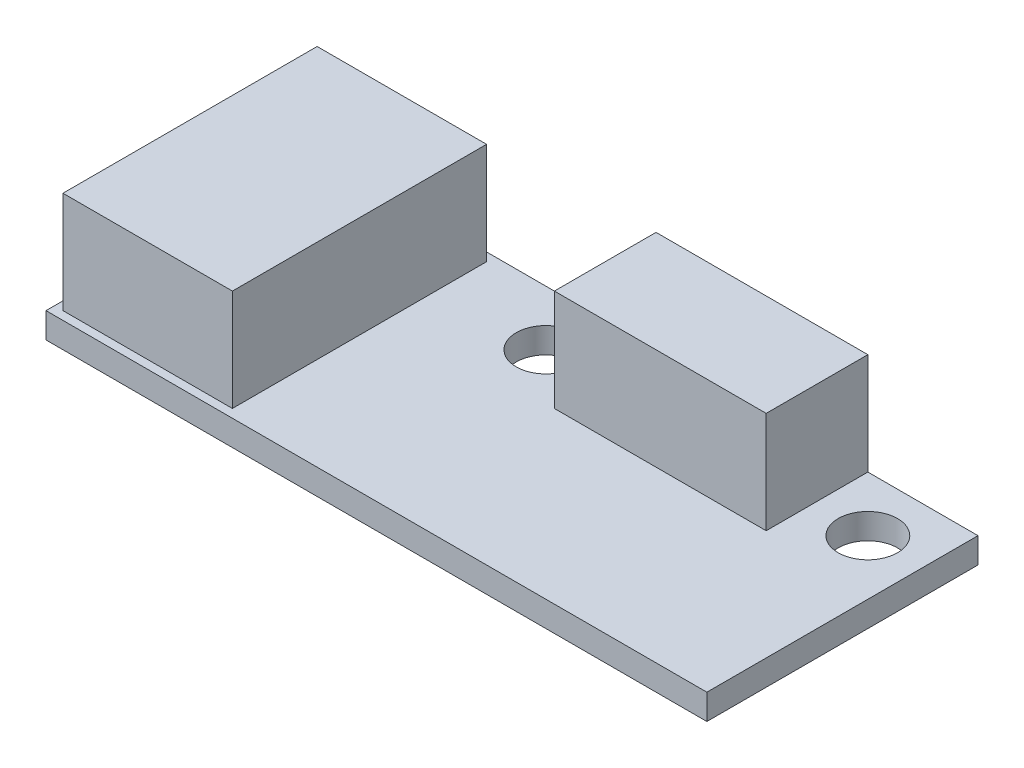
ISO-10303-21;
HEADER;
FILE_DESCRIPTION(('STEP AP214'),'2;1');
FILE_NAME('part.step','',(''),(''),'','','');
FILE_SCHEMA(('AUTOMOTIVE_DESIGN { 1 0 10303 214 1 1 1 1 }'));
ENDSEC;
DATA;
#1=APPLICATION_CONTEXT('core data for automotive mechanical design processes');
#2=APPLICATION_PROTOCOL_DEFINITION('international standard','automotive_design',2000,#1);
#3=PRODUCT_CONTEXT('',#1,'mechanical');
#4=PRODUCT('Part','Part','',(#3));
#5=PRODUCT_RELATED_PRODUCT_CATEGORY('part','',(#4));
#6=PRODUCT_DEFINITION_FORMATION('','',#4);
#7=PRODUCT_DEFINITION_CONTEXT('part definition',#1,'design');
#8=PRODUCT_DEFINITION('design','',#6,#7);
#9=PRODUCT_DEFINITION_SHAPE('','',#8);
#10=(LENGTH_UNIT() NAMED_UNIT(*) SI_UNIT(.MILLI.,.METRE.));
#11=(NAMED_UNIT(*) PLANE_ANGLE_UNIT() SI_UNIT($,.RADIAN.));
#12=(NAMED_UNIT(*) SI_UNIT($,.STERADIAN.) SOLID_ANGLE_UNIT());
#13=UNCERTAINTY_MEASURE_WITH_UNIT(LENGTH_MEASURE(1.E-05),#10,'distance_accuracy_value','');
#14=(GEOMETRIC_REPRESENTATION_CONTEXT(3) GLOBAL_UNCERTAINTY_ASSIGNED_CONTEXT((#13)) GLOBAL_UNIT_ASSIGNED_CONTEXT((#10,
#11,#12)) REPRESENTATION_CONTEXT('',''));
#15=CARTESIAN_POINT('',(0.,0.,0.));
#16=DIRECTION('',(0.,0.,1.));
#17=DIRECTION('',(1.,0.,0.));
#18=AXIS2_PLACEMENT_3D('',#15,#16,#17);
#19=CARTESIAN_POINT('',(0.,1.5,0.));
#20=DIRECTION('',(0.,-1.,0.));
#21=DIRECTION('',(0.,0.,-1.));
#22=AXIS2_PLACEMENT_3D('',#19,#20,#21);
#23=PLANE('',#22);
#24=DIRECTION('',(0.,0.,-1.));
#25=VECTOR('',#24,1.);
#26=CARTESIAN_POINT('',(13.,1.5,-8.));
#27=LINE('',#26,#25);
#28=CARTESIAN_POINT('',(13.,1.5,-2.));
#29=VERTEX_POINT('',#28);
#30=CARTESIAN_POINT('',(13.,1.5,-8.));
#31=VERTEX_POINT('',#30);
#32=EDGE_CURVE('E38',#29,#31,#27,.T.);
#33=ORIENTED_EDGE('',*,*,#32,.F.);
#34=DIRECTION('',(1.,0.,0.));
#35=VECTOR('',#34,1.);
#36=CARTESIAN_POINT('',(13.,1.5,-2.));
#37=LINE('',#36,#35);
#38=CARTESIAN_POINT('',(0.499999999999997,1.5,-2.));
#39=VERTEX_POINT('',#38);
#40=EDGE_CURVE('E158',#39,#29,#37,.T.);
#41=ORIENTED_EDGE('',*,*,#40,.F.);
#42=DIRECTION('',(0.,0.,1.));
#43=VECTOR('',#42,1.);
#44=CARTESIAN_POINT('',(0.499999999999997,1.5,-8.));
#45=LINE('',#44,#43);
#46=CARTESIAN_POINT('',(0.499999999999997,1.5,-8.));
#47=VERTEX_POINT('',#46);
#48=EDGE_CURVE('E149',#47,#39,#45,.T.);
#49=ORIENTED_EDGE('',*,*,#48,.F.);
#50=DIRECTION('',(-1.,0.,0.));
#51=VECTOR('',#50,1.);
#52=CARTESIAN_POINT('',(-19.5,1.5,-8.));
#53=LINE('',#52,#51);
#54=CARTESIAN_POINT('',(-19.5,1.5,-8.));
#55=VERTEX_POINT('',#54);
#56=EDGE_CURVE('E191',#47,#55,#53,.T.);
#57=ORIENTED_EDGE('',*,*,#56,.T.);
#58=DIRECTION('',(0.,0.,1.));
#59=VECTOR('',#58,1.);
#60=CARTESIAN_POINT('',(-19.5,1.5,8.));
#61=LINE('',#60,#59);
#62=CARTESIAN_POINT('',(-19.5,1.5,8.));
#63=VERTEX_POINT('',#62);
#64=EDGE_CURVE('E195',#55,#63,#61,.T.);
#65=ORIENTED_EDGE('',*,*,#64,.T.);
#66=DIRECTION('',(1.,0.,0.));
#67=VECTOR('',#66,1.);
#68=CARTESIAN_POINT('',(-19.5,1.5,8.));
#69=LINE('',#68,#67);
#70=CARTESIAN_POINT('',(19.5,1.5,8.));
#71=VERTEX_POINT('',#70);
#72=EDGE_CURVE('E211',#63,#71,#69,.T.);
#73=ORIENTED_EDGE('',*,*,#72,.T.);
#74=DIRECTION('',(0.,0.,-1.));
#75=VECTOR('',#74,1.);
#76=CARTESIAN_POINT('',(19.5,1.5,8.));
#77=LINE('',#76,#75);
#78=CARTESIAN_POINT('',(19.5,1.5,-8.));
#79=VERTEX_POINT('',#78);
#80=EDGE_CURVE('E188',#71,#79,#77,.T.);
#81=ORIENTED_EDGE('',*,*,#80,.T.);
#82=EDGE_CURVE('E201',#79,#31,#53,.T.);
#83=ORIENTED_EDGE('',*,*,#82,.T.);
#84=EDGE_LOOP('',(#33,#41,#49,#57,#65,#73,#81,#83));
#85=FACE_BOUND('',#84,.T.);
#86=CARTESIAN_POINT('',(-2.75,1.5,-4.75));
#87=DIRECTION('',(0.,1.,0.));
#88=DIRECTION('',(0.,0.,1.));
#89=AXIS2_PLACEMENT_3D('',#86,#87,#88);
#90=CIRCLE('',#89,1.75);
#91=CARTESIAN_POINT('',(-2.75,1.5,-3.));
#92=VERTEX_POINT('',#91);
#93=EDGE_CURVE('E178',#92,#92,#90,.T.);
#94=ORIENTED_EDGE('',*,*,#93,.F.);
#95=EDGE_LOOP('',(#94));
#96=FACE_BOUND('',#95,.T.);
#97=CARTESIAN_POINT('',(16.25,1.5,-4.75));
#98=DIRECTION('',(0.,1.,0.));
#99=DIRECTION('',(0.,0.,1.));
#100=AXIS2_PLACEMENT_3D('',#97,#98,#99);
#101=CIRCLE('',#100,1.75);
#102=CARTESIAN_POINT('',(16.25,1.5,-3.));
#103=VERTEX_POINT('',#102);
#104=EDGE_CURVE('E177',#103,#103,#101,.T.);
#105=ORIENTED_EDGE('',*,*,#104,.F.);
#106=EDGE_LOOP('',(#105));
#107=FACE_BOUND('',#106,.T.);
#108=DIRECTION('',(-1.,0.,0.));
#109=VECTOR('',#108,1.);
#110=CARTESIAN_POINT('',(-9.00000000000001,1.5,-7.5));
#111=LINE('',#110,#109);
#112=CARTESIAN_POINT('',(-9.00000000000001,1.5,-7.5));
#113=VERTEX_POINT('',#112);
#114=CARTESIAN_POINT('',(-19.,1.5,-7.5));
#115=VERTEX_POINT('',#114);
#116=EDGE_CURVE('E146',#113,#115,#111,.T.);
#117=ORIENTED_EDGE('',*,*,#116,.F.);
#118=DIRECTION('',(0.,0.,-1.));
#119=VECTOR('',#118,1.);
#120=CARTESIAN_POINT('',(-9.00000000000001,1.5,-7.5));
#121=LINE('',#120,#119);
#122=CARTESIAN_POINT('',(-9.00000000000001,1.5,7.5));
#123=VERTEX_POINT('',#122);
#124=EDGE_CURVE('E143',#123,#113,#121,.T.);
#125=ORIENTED_EDGE('',*,*,#124,.F.);
#126=DIRECTION('',(1.,0.,0.));
#127=VECTOR('',#126,1.);
#128=CARTESIAN_POINT('',(-19.,1.5,7.5));
#129=LINE('',#128,#127);
#130=CARTESIAN_POINT('',(-19.,1.5,7.5));
#131=VERTEX_POINT('',#130);
#132=EDGE_CURVE('E57',#131,#123,#129,.T.);
#133=ORIENTED_EDGE('',*,*,#132,.F.);
#134=DIRECTION('',(0.,0.,1.));
#135=VECTOR('',#134,1.);
#136=CARTESIAN_POINT('',(-19.,1.5,-7.5));
#137=LINE('',#136,#135);
#138=EDGE_CURVE('E52',#115,#131,#137,.T.);
#139=ORIENTED_EDGE('',*,*,#138,.F.);
#140=EDGE_LOOP('',(#117,#125,#133,#139));
#141=FACE_BOUND('',#140,.T.);
#142=ADVANCED_FACE('F34',(#85,#96,#107,#141),#23,.F.);
#143=CARTESIAN_POINT('',(19.5,1.5,8.));
#144=DIRECTION('',(-1.,0.,0.));
#145=DIRECTION('',(0.,0.,1.));
#146=AXIS2_PLACEMENT_3D('',#143,#144,#145);
#147=PLANE('',#146);
#148=DIRECTION('',(0.,0.,-1.));
#149=VECTOR('',#148,1.);
#150=CARTESIAN_POINT('',(19.5,0.,8.));
#151=LINE('',#150,#149);
#152=CARTESIAN_POINT('',(19.5,0.,8.));
#153=VERTEX_POINT('',#152);
#154=CARTESIAN_POINT('',(19.5,0.,-8.));
#155=VERTEX_POINT('',#154);
#156=EDGE_CURVE('E185',#153,#155,#151,.T.);
#157=ORIENTED_EDGE('',*,*,#156,.T.);
#158=DIRECTION('',(0.,-1.,0.));
#159=VECTOR('',#158,1.);
#160=CARTESIAN_POINT('',(19.5,1.5,-8.));
#161=LINE('',#160,#159);
#162=EDGE_CURVE('E11',#79,#155,#161,.T.);
#163=ORIENTED_EDGE('',*,*,#162,.F.);
#164=ORIENTED_EDGE('',*,*,#80,.F.);
#165=DIRECTION('',(0.,-1.,0.));
#166=VECTOR('',#165,1.);
#167=CARTESIAN_POINT('',(19.5,1.5,8.));
#168=LINE('',#167,#166);
#169=EDGE_CURVE('E208',#71,#153,#168,.T.);
#170=ORIENTED_EDGE('',*,*,#169,.T.);
#171=EDGE_LOOP('',(#157,#163,#164,#170));
#172=FACE_BOUND('',#171,.T.);
#173=ADVANCED_FACE('F36',(#172),#147,.F.);
#174=CARTESIAN_POINT('',(-19.5,1.5,-8.));
#175=DIRECTION('',(0.,0.,1.));
#176=DIRECTION('',(1.,0.,0.));
#177=AXIS2_PLACEMENT_3D('',#174,#175,#176);
#178=PLANE('',#177);
#179=DIRECTION('',(-1.,0.,0.));
#180=VECTOR('',#179,1.);
#181=CARTESIAN_POINT('',(-19.5,0.,-8.));
#182=LINE('',#181,#180);
#183=CARTESIAN_POINT('',(-19.5,0.,-8.));
#184=VERTEX_POINT('',#183);
#185=EDGE_CURVE('E215',#155,#184,#182,.T.);
#186=ORIENTED_EDGE('',*,*,#185,.T.);
#187=DIRECTION('',(0.,-1.,0.));
#188=VECTOR('',#187,1.);
#189=CARTESIAN_POINT('',(-19.5,1.5,-8.));
#190=LINE('',#189,#188);
#191=EDGE_CURVE('E44',#55,#184,#190,.T.);
#192=ORIENTED_EDGE('',*,*,#191,.F.);
#193=ORIENTED_EDGE('',*,*,#56,.F.);
#194=DIRECTION('',(0.,-1.,0.));
#195=VECTOR('',#194,1.);
#196=CARTESIAN_POINT('',(0.499999999999997,7.5,-8.));
#197=LINE('',#196,#195);
#198=CARTESIAN_POINT('',(0.499999999999997,7.5,-8.));
#199=VERTEX_POINT('',#198);
#200=EDGE_CURVE('E173',#199,#47,#197,.T.);
#201=ORIENTED_EDGE('',*,*,#200,.F.);
#202=DIRECTION('',(-1.,0.,0.));
#203=VECTOR('',#202,1.);
#204=CARTESIAN_POINT('',(13.,7.5,-8.));
#205=LINE('',#204,#203);
#206=CARTESIAN_POINT('',(13.,7.5,-8.));
#207=VERTEX_POINT('',#206);
#208=EDGE_CURVE('E157',#207,#199,#205,.T.);
#209=ORIENTED_EDGE('',*,*,#208,.F.);
#210=DIRECTION('',(0.,-1.,0.));
#211=VECTOR('',#210,1.);
#212=CARTESIAN_POINT('',(13.,7.5,-8.));
#213=LINE('',#212,#211);
#214=EDGE_CURVE('E181',#207,#31,#213,.T.);
#215=ORIENTED_EDGE('',*,*,#214,.T.);
#216=ORIENTED_EDGE('',*,*,#82,.F.);
#217=ORIENTED_EDGE('',*,*,#162,.T.);
#218=EDGE_LOOP('',(#186,#192,#193,#201,#209,#215,#216,#217));
#219=FACE_BOUND('',#218,.T.);
#220=ADVANCED_FACE('F239',(#219),#178,.F.);
#221=CARTESIAN_POINT('',(-19.5,1.5,8.));
#222=DIRECTION('',(1.,0.,0.));
#223=DIRECTION('',(0.,0.,-1.));
#224=AXIS2_PLACEMENT_3D('',#221,#222,#223);
#225=PLANE('',#224);
#226=DIRECTION('',(0.,0.,1.));
#227=VECTOR('',#226,1.);
#228=CARTESIAN_POINT('',(-19.5,0.,8.));
#229=LINE('',#228,#227);
#230=CARTESIAN_POINT('',(-19.5,0.,8.));
#231=VERTEX_POINT('',#230);
#232=EDGE_CURVE('E213',#184,#231,#229,.T.);
#233=ORIENTED_EDGE('',*,*,#232,.T.);
#234=DIRECTION('',(0.,-1.,0.));
#235=VECTOR('',#234,1.);
#236=CARTESIAN_POINT('',(-19.5,1.5,8.));
#237=LINE('',#236,#235);
#238=EDGE_CURVE('E205',#63,#231,#237,.T.);
#239=ORIENTED_EDGE('',*,*,#238,.F.);
#240=ORIENTED_EDGE('',*,*,#64,.F.);
#241=ORIENTED_EDGE('',*,*,#191,.T.);
#242=EDGE_LOOP('',(#233,#239,#240,#241));
#243=FACE_BOUND('',#242,.T.);
#244=ADVANCED_FACE('F227',(#243),#225,.F.);
#245=CARTESIAN_POINT('',(-19.5,1.5,8.));
#246=DIRECTION('',(0.,0.,-1.));
#247=DIRECTION('',(-1.,0.,0.));
#248=AXIS2_PLACEMENT_3D('',#245,#246,#247);
#249=PLANE('',#248);
#250=DIRECTION('',(1.,0.,0.));
#251=VECTOR('',#250,1.);
#252=CARTESIAN_POINT('',(-19.5,0.,8.));
#253=LINE('',#252,#251);
#254=EDGE_CURVE('E192',#231,#153,#253,.T.);
#255=ORIENTED_EDGE('',*,*,#254,.T.);
#256=ORIENTED_EDGE('',*,*,#169,.F.);
#257=ORIENTED_EDGE('',*,*,#72,.F.);
#258=ORIENTED_EDGE('',*,*,#238,.T.);
#259=EDGE_LOOP('',(#255,#256,#257,#258));
#260=FACE_BOUND('',#259,.T.);
#261=ADVANCED_FACE('F231',(#260),#249,.F.);
#262=CARTESIAN_POINT('',(0.,0.,0.));
#263=DIRECTION('',(0.,-1.,0.));
#264=DIRECTION('',(0.,0.,-1.));
#265=AXIS2_PLACEMENT_3D('',#262,#263,#264);
#266=PLANE('',#265);
#267=CARTESIAN_POINT('',(-2.75,0.,-4.75));
#268=DIRECTION('',(0.,1.,0.));
#269=DIRECTION('',(0.,0.,1.));
#270=AXIS2_PLACEMENT_3D('',#267,#268,#269);
#271=CIRCLE('',#270,1.75);
#272=CARTESIAN_POINT('',(-2.75,0.,-3.));
#273=VERTEX_POINT('',#272);
#274=EDGE_CURVE('E174',#273,#273,#271,.T.);
#275=ORIENTED_EDGE('',*,*,#274,.T.);
#276=EDGE_LOOP('',(#275));
#277=FACE_BOUND('',#276,.T.);
#278=CARTESIAN_POINT('',(16.25,0.,-4.75));
#279=DIRECTION('',(0.,1.,0.));
#280=DIRECTION('',(0.,0.,1.));
#281=AXIS2_PLACEMENT_3D('',#278,#279,#280);
#282=CIRCLE('',#281,1.75);
#283=CARTESIAN_POINT('',(16.25,0.,-3.));
#284=VERTEX_POINT('',#283);
#285=EDGE_CURVE('E182',#284,#284,#282,.T.);
#286=ORIENTED_EDGE('',*,*,#285,.T.);
#287=EDGE_LOOP('',(#286));
#288=FACE_BOUND('',#287,.T.);
#289=ORIENTED_EDGE('',*,*,#156,.F.);
#290=ORIENTED_EDGE('',*,*,#254,.F.);
#291=ORIENTED_EDGE('',*,*,#232,.F.);
#292=ORIENTED_EDGE('',*,*,#185,.F.);
#293=EDGE_LOOP('',(#289,#290,#291,#292));
#294=FACE_BOUND('',#293,.T.);
#295=ADVANCED_FACE('F262',(#277,#288,#294),#266,.T.);
#296=CARTESIAN_POINT('',(16.25,0.,-4.75));
#297=DIRECTION('',(0.,1.,0.));
#298=DIRECTION('',(0.,0.,1.));
#299=AXIS2_PLACEMENT_3D('',#296,#297,#298);
#300=CYLINDRICAL_SURFACE('',#299,1.75);
#301=ORIENTED_EDGE('',*,*,#285,.F.);
#302=EDGE_LOOP('',(#301));
#303=FACE_BOUND('',#302,.T.);
#304=ORIENTED_EDGE('',*,*,#104,.T.);
#305=EDGE_LOOP('',(#304));
#306=FACE_BOUND('',#305,.T.);
#307=ADVANCED_FACE('F264',(#303,#306),#300,.F.);
#308=CARTESIAN_POINT('',(-2.75,0.,-4.75));
#309=DIRECTION('',(0.,1.,0.));
#310=DIRECTION('',(0.,0.,1.));
#311=AXIS2_PLACEMENT_3D('',#308,#309,#310);
#312=CYLINDRICAL_SURFACE('',#311,1.75);
#313=ORIENTED_EDGE('',*,*,#274,.F.);
#314=EDGE_LOOP('',(#313));
#315=FACE_BOUND('',#314,.T.);
#316=ORIENTED_EDGE('',*,*,#93,.T.);
#317=EDGE_LOOP('',(#316));
#318=FACE_BOUND('',#317,.T.);
#319=ADVANCED_FACE('F271',(#315,#318),#312,.F.);
#320=CARTESIAN_POINT('',(13.,7.5,-8.));
#321=DIRECTION('',(-1.,0.,0.));
#322=DIRECTION('',(0.,0.,1.));
#323=AXIS2_PLACEMENT_3D('',#320,#321,#322);
#324=PLANE('',#323);
#325=ORIENTED_EDGE('',*,*,#32,.T.);
#326=ORIENTED_EDGE('',*,*,#214,.F.);
#327=DIRECTION('',(0.,0.,-1.));
#328=VECTOR('',#327,1.);
#329=CARTESIAN_POINT('',(13.,7.5,-8.));
#330=LINE('',#329,#328);
#331=CARTESIAN_POINT('',(13.,7.5,-2.));
#332=VERTEX_POINT('',#331);
#333=EDGE_CURVE('E154',#332,#207,#330,.T.);
#334=ORIENTED_EDGE('',*,*,#333,.F.);
#335=DIRECTION('',(0.,-1.,0.));
#336=VECTOR('',#335,1.);
#337=CARTESIAN_POINT('',(13.,7.5,-2.));
#338=LINE('',#337,#336);
#339=EDGE_CURVE('E163',#332,#29,#338,.T.);
#340=ORIENTED_EDGE('',*,*,#339,.T.);
#341=EDGE_LOOP('',(#325,#326,#334,#340));
#342=FACE_BOUND('',#341,.T.);
#343=ADVANCED_FACE('F244',(#342),#324,.F.);
#344=CARTESIAN_POINT('',(0.499999999999997,7.5,-8.));
#345=DIRECTION('',(1.,0.,0.));
#346=DIRECTION('',(0.,0.,-1.));
#347=AXIS2_PLACEMENT_3D('',#344,#345,#346);
#348=PLANE('',#347);
#349=ORIENTED_EDGE('',*,*,#48,.T.);
#350=DIRECTION('',(0.,-1.,0.));
#351=VECTOR('',#350,1.);
#352=CARTESIAN_POINT('',(0.499999999999997,7.5,-2.));
#353=LINE('',#352,#351);
#354=CARTESIAN_POINT('',(0.499999999999997,7.5,-2.));
#355=VERTEX_POINT('',#354);
#356=EDGE_CURVE('E170',#355,#39,#353,.T.);
#357=ORIENTED_EDGE('',*,*,#356,.F.);
#358=DIRECTION('',(0.,0.,1.));
#359=VECTOR('',#358,1.);
#360=CARTESIAN_POINT('',(0.499999999999997,7.5,-8.));
#361=LINE('',#360,#359);
#362=EDGE_CURVE('E160',#199,#355,#361,.T.);
#363=ORIENTED_EDGE('',*,*,#362,.F.);
#364=ORIENTED_EDGE('',*,*,#200,.T.);
#365=EDGE_LOOP('',(#349,#357,#363,#364));
#366=FACE_BOUND('',#365,.T.);
#367=ADVANCED_FACE('F253',(#366),#348,.F.);
#368=CARTESIAN_POINT('',(13.,7.5,-2.));
#369=DIRECTION('',(0.,0.,-1.));
#370=DIRECTION('',(-1.,0.,0.));
#371=AXIS2_PLACEMENT_3D('',#368,#369,#370);
#372=PLANE('',#371);
#373=ORIENTED_EDGE('',*,*,#40,.T.);
#374=ORIENTED_EDGE('',*,*,#339,.F.);
#375=DIRECTION('',(1.,0.,0.));
#376=VECTOR('',#375,1.);
#377=CARTESIAN_POINT('',(13.,7.5,-2.));
#378=LINE('',#377,#376);
#379=EDGE_CURVE('E162',#355,#332,#378,.T.);
#380=ORIENTED_EDGE('',*,*,#379,.F.);
#381=ORIENTED_EDGE('',*,*,#356,.T.);
#382=EDGE_LOOP('',(#373,#374,#380,#381));
#383=FACE_BOUND('',#382,.T.);
#384=ADVANCED_FACE('F248',(#383),#372,.F.);
#385=CARTESIAN_POINT('',(0.,7.5,0.));
#386=DIRECTION('',(0.,-1.,0.));
#387=DIRECTION('',(0.,0.,-1.));
#388=AXIS2_PLACEMENT_3D('',#385,#386,#387);
#389=PLANE('',#388);
#390=ORIENTED_EDGE('',*,*,#333,.T.);
#391=ORIENTED_EDGE('',*,*,#208,.T.);
#392=ORIENTED_EDGE('',*,*,#362,.T.);
#393=ORIENTED_EDGE('',*,*,#379,.T.);
#394=EDGE_LOOP('',(#390,#391,#392,#393));
#395=FACE_BOUND('',#394,.T.);
#396=ADVANCED_FACE('F291',(#395),#389,.F.);
#397=CARTESIAN_POINT('',(-9.00000000000001,7.5,-7.5));
#398=DIRECTION('',(0.,0.,1.));
#399=DIRECTION('',(1.,0.,0.));
#400=AXIS2_PLACEMENT_3D('',#397,#398,#399);
#401=PLANE('',#400);
#402=ORIENTED_EDGE('',*,*,#116,.T.);
#403=DIRECTION('',(0.,-1.,0.));
#404=VECTOR('',#403,1.);
#405=CARTESIAN_POINT('',(-19.,7.5,-7.5));
#406=LINE('',#405,#404);
#407=CARTESIAN_POINT('',(-19.,7.5,-7.5));
#408=VERTEX_POINT('',#407);
#409=EDGE_CURVE('E127',#408,#115,#406,.T.);
#410=ORIENTED_EDGE('',*,*,#409,.F.);
#411=DIRECTION('',(-1.,0.,0.));
#412=VECTOR('',#411,1.);
#413=CARTESIAN_POINT('',(-9.00000000000001,7.5,-7.5));
#414=LINE('',#413,#412);
#415=CARTESIAN_POINT('',(-9.00000000000001,7.5,-7.5));
#416=VERTEX_POINT('',#415);
#417=EDGE_CURVE('E134',#416,#408,#414,.T.);
#418=ORIENTED_EDGE('',*,*,#417,.F.);
#419=DIRECTION('',(0.,-1.,0.));
#420=VECTOR('',#419,1.);
#421=CARTESIAN_POINT('',(-9.00000000000001,7.5,-7.5));
#422=LINE('',#421,#420);
#423=EDGE_CURVE('E414',#416,#113,#422,.T.);
#424=ORIENTED_EDGE('',*,*,#423,.T.);
#425=EDGE_LOOP('',(#402,#410,#418,#424));
#426=FACE_BOUND('',#425,.T.);
#427=ADVANCED_FACE('F145',(#426),#401,.F.);
#428=CARTESIAN_POINT('',(-19.,7.5,-7.5));
#429=DIRECTION('',(1.,0.,0.));
#430=DIRECTION('',(0.,0.,-1.));
#431=AXIS2_PLACEMENT_3D('',#428,#429,#430);
#432=PLANE('',#431);
#433=ORIENTED_EDGE('',*,*,#138,.T.);
#434=DIRECTION('',(0.,-1.,0.));
#435=VECTOR('',#434,1.);
#436=CARTESIAN_POINT('',(-19.,7.5,7.5));
#437=LINE('',#436,#435);
#438=CARTESIAN_POINT('',(-19.,7.5,7.5));
#439=VERTEX_POINT('',#438);
#440=EDGE_CURVE('E130',#439,#131,#437,.T.);
#441=ORIENTED_EDGE('',*,*,#440,.F.);
#442=DIRECTION('',(0.,0.,1.));
#443=VECTOR('',#442,1.);
#444=CARTESIAN_POINT('',(-19.,7.5,-7.5));
#445=LINE('',#444,#443);
#446=EDGE_CURVE('E123',#408,#439,#445,.T.);
#447=ORIENTED_EDGE('',*,*,#446,.F.);
#448=ORIENTED_EDGE('',*,*,#409,.T.);
#449=EDGE_LOOP('',(#433,#441,#447,#448));
#450=FACE_BOUND('',#449,.T.);
#451=ADVANCED_FACE('F125',(#450),#432,.F.);
#452=CARTESIAN_POINT('',(-19.,7.5,7.5));
#453=DIRECTION('',(0.,0.,-1.));
#454=DIRECTION('',(-1.,0.,0.));
#455=AXIS2_PLACEMENT_3D('',#452,#453,#454);
#456=PLANE('',#455);
#457=ORIENTED_EDGE('',*,*,#132,.T.);
#458=DIRECTION('',(0.,-1.,0.));
#459=VECTOR('',#458,1.);
#460=CARTESIAN_POINT('',(-9.00000000000001,7.5,7.5));
#461=LINE('',#460,#459);
#462=CARTESIAN_POINT('',(-9.00000000000001,7.5,7.5));
#463=VERTEX_POINT('',#462);
#464=EDGE_CURVE('E150',#463,#123,#461,.T.);
#465=ORIENTED_EDGE('',*,*,#464,.F.);
#466=DIRECTION('',(1.,0.,0.));
#467=VECTOR('',#466,1.);
#468=CARTESIAN_POINT('',(-19.,7.5,7.5));
#469=LINE('',#468,#467);
#470=EDGE_CURVE('E133',#439,#463,#469,.T.);
#471=ORIENTED_EDGE('',*,*,#470,.F.);
#472=ORIENTED_EDGE('',*,*,#440,.T.);
#473=EDGE_LOOP('',(#457,#465,#471,#472));
#474=FACE_BOUND('',#473,.T.);
#475=ADVANCED_FACE('F299',(#474),#456,.F.);
#476=CARTESIAN_POINT('',(-9.00000000000001,7.5,-7.5));
#477=DIRECTION('',(-1.,0.,0.));
#478=DIRECTION('',(0.,0.,1.));
#479=AXIS2_PLACEMENT_3D('',#476,#477,#478);
#480=PLANE('',#479);
#481=ORIENTED_EDGE('',*,*,#124,.T.);
#482=ORIENTED_EDGE('',*,*,#423,.F.);
#483=DIRECTION('',(0.,0.,-1.));
#484=VECTOR('',#483,1.);
#485=CARTESIAN_POINT('',(-9.00000000000001,7.5,-7.5));
#486=LINE('',#485,#484);
#487=EDGE_CURVE('E139',#463,#416,#486,.T.);
#488=ORIENTED_EDGE('',*,*,#487,.F.);
#489=ORIENTED_EDGE('',*,*,#464,.T.);
#490=EDGE_LOOP('',(#481,#482,#488,#489));
#491=FACE_BOUND('',#490,.T.);
#492=ADVANCED_FACE('F302',(#491),#480,.F.);
#493=CARTESIAN_POINT('',(0.,7.5,0.));
#494=DIRECTION('',(0.,1.,0.));
#495=DIRECTION('',(0.,0.,1.));
#496=AXIS2_PLACEMENT_3D('',#493,#494,#495);
#497=PLANE('',#496);
#498=ORIENTED_EDGE('',*,*,#417,.T.);
#499=ORIENTED_EDGE('',*,*,#446,.T.);
#500=ORIENTED_EDGE('',*,*,#470,.T.);
#501=ORIENTED_EDGE('',*,*,#487,.T.);
#502=EDGE_LOOP('',(#498,#499,#500,#501));
#503=FACE_BOUND('',#502,.T.);
#504=ADVANCED_FACE('F137',(#503),#497,.T.);
#505=CLOSED_SHELL('',(#142,#173,#220,#244,#261,#295,#307,#319,#343,#367,#384,#396,#427,#451,
#475,#492,#504));
#506=MANIFOLD_SOLID_BREP('B2',#505);
#507=ADVANCED_BREP_SHAPE_REPRESENTATION('',(#18,#506),#14);
#508=SHAPE_DEFINITION_REPRESENTATION(#9,#507);
ENDSEC;
END-ISO-10303-21;
